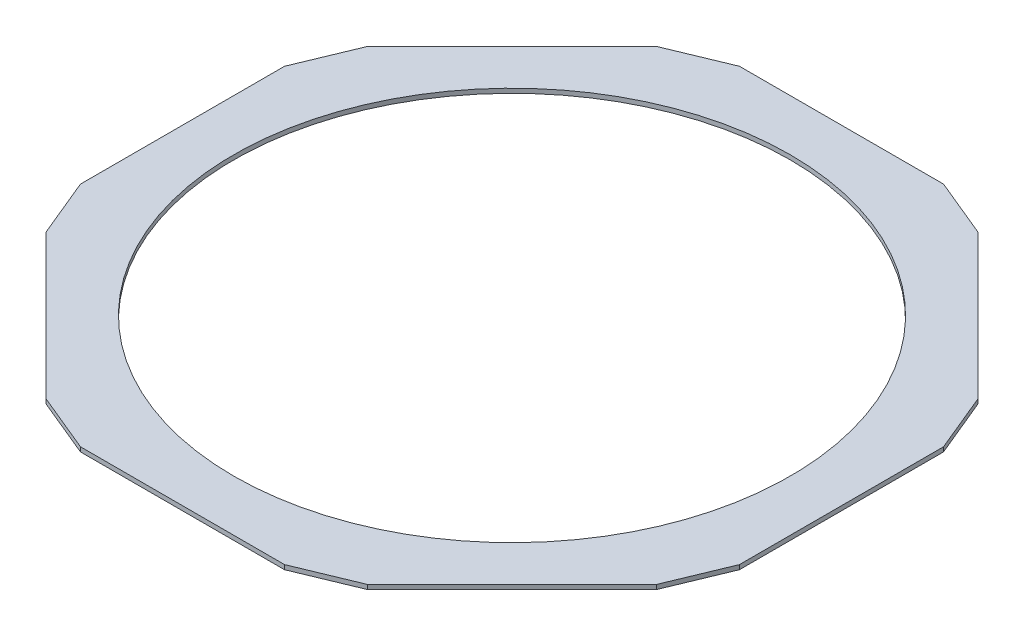
ISO-10303-21;
HEADER;
FILE_DESCRIPTION(('STEP AP214'),'2;1');
FILE_NAME('part.step','',(''),(''),'','','');
FILE_SCHEMA(('AUTOMOTIVE_DESIGN { 1 0 10303 214 1 1 1 1 }'));
ENDSEC;
DATA;
#1=APPLICATION_CONTEXT('core data for automotive mechanical design processes');
#2=APPLICATION_PROTOCOL_DEFINITION('international standard','automotive_design',2000,#1);
#3=PRODUCT_CONTEXT('',#1,'mechanical');
#4=PRODUCT('Part','Part','',(#3));
#5=PRODUCT_RELATED_PRODUCT_CATEGORY('part','',(#4));
#6=PRODUCT_DEFINITION_FORMATION('','',#4);
#7=PRODUCT_DEFINITION_CONTEXT('part definition',#1,'design');
#8=PRODUCT_DEFINITION('design','',#6,#7);
#9=PRODUCT_DEFINITION_SHAPE('','',#8);
#10=(LENGTH_UNIT() NAMED_UNIT(*) SI_UNIT(.MILLI.,.METRE.));
#11=(NAMED_UNIT(*) PLANE_ANGLE_UNIT() SI_UNIT($,.RADIAN.));
#12=(NAMED_UNIT(*) SI_UNIT($,.STERADIAN.) SOLID_ANGLE_UNIT());
#13=UNCERTAINTY_MEASURE_WITH_UNIT(LENGTH_MEASURE(1.E-05),#10,'distance_accuracy_value','');
#14=(GEOMETRIC_REPRESENTATION_CONTEXT(3) GLOBAL_UNCERTAINTY_ASSIGNED_CONTEXT((#13)) GLOBAL_UNIT_ASSIGNED_CONTEXT((#10,
#11,#12)) REPRESENTATION_CONTEXT('',''));
#15=CARTESIAN_POINT('',(0.,0.,0.));
#16=DIRECTION('',(0.,0.,1.));
#17=DIRECTION('',(1.,0.,0.));
#18=AXIS2_PLACEMENT_3D('',#15,#16,#17);
#19=CARTESIAN_POINT('',(0.,0.24,0.));
#20=DIRECTION('',(0.,1.,0.));
#21=DIRECTION('',(0.,0.,1.));
#22=AXIS2_PLACEMENT_3D('',#19,#20,#21);
#23=PLANE('',#22);
#24=DIRECTION('',(0.923879532511292,0.,0.382683432365078));
#25=VECTOR('',#24,1.);
#26=CARTESIAN_POINT('',(-3.16890679651373,0.24,-1.31260417301222));
#27=LINE('',#26,#25);
#28=CARTESIAN_POINT('',(-3.16890679651373,0.24,-1.31260417301222));
#29=VERTEX_POINT('',#28);
#30=CARTESIAN_POINT('',(0.,0.24,0.));
#31=VERTEX_POINT('',#30);
#32=EDGE_CURVE('E236',#29,#31,#27,.T.);
#33=ORIENTED_EDGE('',*,*,#32,.T.);
#34=DIRECTION('',(1.,0.,0.));
#35=VECTOR('',#34,1.);
#36=CARTESIAN_POINT('',(0.,0.24,0.));
#37=LINE('',#36,#35);
#38=CARTESIAN_POINT('',(11.,0.24,0.));
#39=VERTEX_POINT('',#38);
#40=EDGE_CURVE('E124',#31,#39,#37,.T.);
#41=ORIENTED_EDGE('',*,*,#40,.T.);
#42=DIRECTION('',(0.923879532511296,0.,-0.382683432365068));
#43=VECTOR('',#42,1.);
#44=CARTESIAN_POINT('',(11.,0.24,0.));
#45=LINE('',#44,#43);
#46=CARTESIAN_POINT('',(14.1689067965137,0.24,-1.31260417301218));
#47=VERTEX_POINT('',#46);
#48=EDGE_CURVE('E289',#39,#47,#45,.T.);
#49=ORIENTED_EDGE('',*,*,#48,.T.);
#50=DIRECTION('',(0.707106781186546,0.,-0.707106781186549));
#51=VECTOR('',#50,1.);
#52=CARTESIAN_POINT('',(14.1689067965137,0.24,-1.31260417301218));
#53=LINE('',#52,#51);
#54=CARTESIAN_POINT('',(21.9470813895658,0.24,-9.09077876606422));
#55=VERTEX_POINT('',#54);
#56=EDGE_CURVE('E309',#47,#55,#53,.T.);
#57=ORIENTED_EDGE('',*,*,#56,.T.);
#58=DIRECTION('',(0.382683432365071,0.,-0.923879532511295));
#59=VECTOR('',#58,1.);
#60=CARTESIAN_POINT('',(21.9470813895658,0.24,-9.09077876606422));
#61=LINE('',#60,#59);
#62=CARTESIAN_POINT('',(23.2596855625779,0.24,-12.259685562578));
#63=VERTEX_POINT('',#62);
#64=EDGE_CURVE('E305',#55,#63,#61,.T.);
#65=ORIENTED_EDGE('',*,*,#64,.T.);
#66=DIRECTION('',(0.,0.,-1.));
#67=VECTOR('',#66,1.);
#68=CARTESIAN_POINT('',(23.2596855625779,0.24,-12.259685562578));
#69=LINE('',#68,#67);
#70=CARTESIAN_POINT('',(23.2596855625779,0.24,-23.259685562578));
#71=VERTEX_POINT('',#70);
#72=EDGE_CURVE('E308',#63,#71,#69,.T.);
#73=ORIENTED_EDGE('',*,*,#72,.T.);
#74=DIRECTION('',(-0.382683432365094,0.,-0.923879532511285));
#75=VECTOR('',#74,1.);
#76=CARTESIAN_POINT('',(23.2596855625779,0.24,-23.259685562578));
#77=LINE('',#76,#75);
#78=CARTESIAN_POINT('',(21.9470813895657,0.24,-26.4285923590917));
#79=VERTEX_POINT('',#78);
#80=EDGE_CURVE('E313',#71,#79,#77,.T.);
#81=ORIENTED_EDGE('',*,*,#80,.T.);
#82=DIRECTION('',(-0.707106781186549,0.,-0.707106781186546));
#83=VECTOR('',#82,1.);
#84=CARTESIAN_POINT('',(21.9470813895657,0.24,-26.4285923590917));
#85=LINE('',#84,#83);
#86=CARTESIAN_POINT('',(14.1689067965136,0.24,-34.2067669521437));
#87=VERTEX_POINT('',#86);
#88=EDGE_CURVE('E320',#79,#87,#85,.T.);
#89=ORIENTED_EDGE('',*,*,#88,.T.);
#90=DIRECTION('',(-0.923879532511288,0.,-0.382683432365087));
#91=VECTOR('',#90,1.);
#92=CARTESIAN_POINT('',(14.1689067965136,0.24,-34.2067669521437));
#93=LINE('',#92,#91);
#94=CARTESIAN_POINT('',(10.9999999999999,0.24,-35.5193711251559));
#95=VERTEX_POINT('',#94);
#96=EDGE_CURVE('E323',#87,#95,#93,.T.);
#97=ORIENTED_EDGE('',*,*,#96,.T.);
#98=DIRECTION('',(-1.,0.,0.));
#99=VECTOR('',#98,1.);
#100=CARTESIAN_POINT('',(10.9999999999999,0.24,-35.5193711251559));
#101=LINE('',#100,#99);
#102=CARTESIAN_POINT('',(0.,0.24,-35.5193711251559));
#103=VERTEX_POINT('',#102);
#104=EDGE_CURVE('E326',#95,#103,#101,.T.);
#105=ORIENTED_EDGE('',*,*,#104,.T.);
#106=DIRECTION('',(-0.923879532511287,0.,0.382683432365089));
#107=VECTOR('',#106,1.);
#108=CARTESIAN_POINT('',(0.,0.24,-35.5193711251559));
#109=LINE('',#108,#107);
#110=CARTESIAN_POINT('',(-3.16890679651378,0.24,-34.2067669521437));
#111=VERTEX_POINT('',#110);
#112=EDGE_CURVE('E329',#103,#111,#109,.T.);
#113=ORIENTED_EDGE('',*,*,#112,.T.);
#114=DIRECTION('',(-0.707106781186546,0.,0.707106781186549));
#115=VECTOR('',#114,1.);
#116=CARTESIAN_POINT('',(-3.16890679651378,0.24,-34.2067669521437));
#117=LINE('',#116,#115);
#118=CARTESIAN_POINT('',(-10.9470813895658,0.24,-26.4285923590916));
#119=VERTEX_POINT('',#118);
#120=EDGE_CURVE('E332',#111,#119,#117,.T.);
#121=ORIENTED_EDGE('',*,*,#120,.T.);
#122=DIRECTION('',(-0.38268343236509,0.,0.923879532511287));
#123=VECTOR('',#122,1.);
#124=CARTESIAN_POINT('',(-10.9470813895658,0.24,-26.4285923590916));
#125=LINE('',#124,#123);
#126=CARTESIAN_POINT('',(-12.259685562578,0.24,-23.2596855625779));
#127=VERTEX_POINT('',#126);
#128=EDGE_CURVE('E167',#119,#127,#125,.T.);
#129=ORIENTED_EDGE('',*,*,#128,.T.);
#130=DIRECTION('',(0.,0.,1.));
#131=VECTOR('',#130,1.);
#132=CARTESIAN_POINT('',(-12.259685562578,0.24,-23.2596855625779));
#133=LINE('',#132,#131);
#134=CARTESIAN_POINT('',(-12.259685562578,0.24,-12.2596855625779));
#135=VERTEX_POINT('',#134);
#136=EDGE_CURVE('E161',#127,#135,#133,.T.);
#137=ORIENTED_EDGE('',*,*,#136,.T.);
#138=DIRECTION('',(0.382683432365087,0.,0.923879532511288));
#139=VECTOR('',#138,1.);
#140=CARTESIAN_POINT('',(-12.259685562578,0.24,-12.2596855625779));
#141=LINE('',#140,#139);
#142=CARTESIAN_POINT('',(-10.9470813895658,0.24,-9.0907787660642));
#143=VERTEX_POINT('',#142);
#144=EDGE_CURVE('E165',#135,#143,#141,.T.);
#145=ORIENTED_EDGE('',*,*,#144,.T.);
#146=DIRECTION('',(0.707106781186551,0.,0.707106781186544));
#147=VECTOR('',#146,1.);
#148=CARTESIAN_POINT('',(-3.16890679651373,0.24,-1.31260417301222));
#149=LINE('',#148,#147);
#150=EDGE_CURVE('E57',#143,#29,#149,.T.);
#151=ORIENTED_EDGE('',*,*,#150,.T.);
#152=EDGE_LOOP('',(#33,#41,#49,#57,#65,#73,#81,#89,#97,#105,#113,#121,#129,#137,#145,#151));
#153=FACE_BOUND('',#152,.T.);
#154=CARTESIAN_POINT('',(5.49999999999994,0.24,-17.7596855625779));
#155=DIRECTION('',(0.,1.,0.));
#156=DIRECTION('',(0.,0.,1.));
#157=AXIS2_PLACEMENT_3D('',#154,#155,#156);
#158=CIRCLE('',#157,15.);
#159=CARTESIAN_POINT('',(5.49999999999994,0.24,-2.75968556257792));
#160=VERTEX_POINT('',#159);
#161=EDGE_CURVE('E194',#160,#160,#158,.T.);
#162=ORIENTED_EDGE('',*,*,#161,.F.);
#163=EDGE_LOOP('',(#162));
#164=FACE_BOUND('',#163,.T.);
#165=ADVANCED_FACE('F39',(#153,#164),#23,.T.);
#166=CARTESIAN_POINT('',(0.,0.,0.));
#167=DIRECTION('',(0.,1.,0.));
#168=DIRECTION('',(0.,0.,1.));
#169=AXIS2_PLACEMENT_3D('',#166,#167,#168);
#170=PLANE('',#169);
#171=DIRECTION('',(0.923879532511292,0.,0.382683432365078));
#172=VECTOR('',#171,1.);
#173=CARTESIAN_POINT('',(-3.16890679651373,0.,-1.31260417301222));
#174=LINE('',#173,#172);
#175=CARTESIAN_POINT('',(-3.16890679651373,0.,-1.31260417301222));
#176=VERTEX_POINT('',#175);
#177=CARTESIAN_POINT('',(0.,0.,0.));
#178=VERTEX_POINT('',#177);
#179=EDGE_CURVE('E189',#176,#178,#174,.T.);
#180=ORIENTED_EDGE('',*,*,#179,.F.);
#181=DIRECTION('',(0.707106781186551,0.,0.707106781186544));
#182=VECTOR('',#181,1.);
#183=CARTESIAN_POINT('',(-3.16890679651373,0.,-1.31260417301222));
#184=LINE('',#183,#182);
#185=CARTESIAN_POINT('',(-10.9470813895658,0.,-9.0907787660642));
#186=VERTEX_POINT('',#185);
#187=EDGE_CURVE('E116',#186,#176,#184,.T.);
#188=ORIENTED_EDGE('',*,*,#187,.F.);
#189=DIRECTION('',(0.382683432365087,0.,0.923879532511288));
#190=VECTOR('',#189,1.);
#191=CARTESIAN_POINT('',(-12.259685562578,0.,-12.2596855625779));
#192=LINE('',#191,#190);
#193=CARTESIAN_POINT('',(-12.259685562578,0.,-12.2596855625779));
#194=VERTEX_POINT('',#193);
#195=EDGE_CURVE('E110',#194,#186,#192,.T.);
#196=ORIENTED_EDGE('',*,*,#195,.F.);
#197=DIRECTION('',(0.,0.,1.));
#198=VECTOR('',#197,1.);
#199=CARTESIAN_POINT('',(-12.259685562578,0.,-23.2596855625779));
#200=LINE('',#199,#198);
#201=CARTESIAN_POINT('',(-12.259685562578,0.,-23.2596855625779));
#202=VERTEX_POINT('',#201);
#203=EDGE_CURVE('E176',#202,#194,#200,.T.);
#204=ORIENTED_EDGE('',*,*,#203,.F.);
#205=DIRECTION('',(-0.38268343236509,0.,0.923879532511287));
#206=VECTOR('',#205,1.);
#207=CARTESIAN_POINT('',(-10.9470813895658,0.,-26.4285923590916));
#208=LINE('',#207,#206);
#209=CARTESIAN_POINT('',(-10.9470813895658,0.,-26.4285923590916));
#210=VERTEX_POINT('',#209);
#211=EDGE_CURVE('E227',#210,#202,#208,.T.);
#212=ORIENTED_EDGE('',*,*,#211,.F.);
#213=DIRECTION('',(-0.707106781186546,0.,0.707106781186549));
#214=VECTOR('',#213,1.);
#215=CARTESIAN_POINT('',(-3.16890679651378,0.,-34.2067669521437));
#216=LINE('',#215,#214);
#217=CARTESIAN_POINT('',(-3.16890679651378,0.,-34.2067669521437));
#218=VERTEX_POINT('',#217);
#219=EDGE_CURVE('E224',#218,#210,#216,.T.);
#220=ORIENTED_EDGE('',*,*,#219,.F.);
#221=DIRECTION('',(-0.923879532511287,0.,0.382683432365089));
#222=VECTOR('',#221,1.);
#223=CARTESIAN_POINT('',(0.,0.,-35.5193711251559));
#224=LINE('',#223,#222);
#225=CARTESIAN_POINT('',(0.,0.,-35.5193711251559));
#226=VERTEX_POINT('',#225);
#227=EDGE_CURVE('E221',#226,#218,#224,.T.);
#228=ORIENTED_EDGE('',*,*,#227,.F.);
#229=DIRECTION('',(-1.,0.,0.));
#230=VECTOR('',#229,1.);
#231=CARTESIAN_POINT('',(10.9999999999999,0.,-35.5193711251559));
#232=LINE('',#231,#230);
#233=CARTESIAN_POINT('',(10.9999999999999,0.,-35.5193711251559));
#234=VERTEX_POINT('',#233);
#235=EDGE_CURVE('E218',#234,#226,#232,.T.);
#236=ORIENTED_EDGE('',*,*,#235,.F.);
#237=DIRECTION('',(-0.923879532511288,0.,-0.382683432365087));
#238=VECTOR('',#237,1.);
#239=CARTESIAN_POINT('',(14.1689067965136,0.,-34.2067669521437));
#240=LINE('',#239,#238);
#241=CARTESIAN_POINT('',(14.1689067965136,0.,-34.2067669521437));
#242=VERTEX_POINT('',#241);
#243=EDGE_CURVE('E215',#242,#234,#240,.T.);
#244=ORIENTED_EDGE('',*,*,#243,.F.);
#245=DIRECTION('',(-0.707106781186549,0.,-0.707106781186546));
#246=VECTOR('',#245,1.);
#247=CARTESIAN_POINT('',(21.9470813895657,0.,-26.4285923590917));
#248=LINE('',#247,#246);
#249=CARTESIAN_POINT('',(21.9470813895657,0.,-26.4285923590917));
#250=VERTEX_POINT('',#249);
#251=EDGE_CURVE('E212',#250,#242,#248,.T.);
#252=ORIENTED_EDGE('',*,*,#251,.F.);
#253=DIRECTION('',(-0.382683432365094,0.,-0.923879532511285));
#254=VECTOR('',#253,1.);
#255=CARTESIAN_POINT('',(23.2596855625779,0.,-23.259685562578));
#256=LINE('',#255,#254);
#257=CARTESIAN_POINT('',(23.2596855625779,0.,-23.259685562578));
#258=VERTEX_POINT('',#257);
#259=EDGE_CURVE('E209',#258,#250,#256,.T.);
#260=ORIENTED_EDGE('',*,*,#259,.F.);
#261=DIRECTION('',(0.,0.,-1.));
#262=VECTOR('',#261,1.);
#263=CARTESIAN_POINT('',(23.2596855625779,0.,-12.259685562578));
#264=LINE('',#263,#262);
#265=CARTESIAN_POINT('',(23.2596855625779,0.,-12.259685562578));
#266=VERTEX_POINT('',#265);
#267=EDGE_CURVE('E206',#266,#258,#264,.T.);
#268=ORIENTED_EDGE('',*,*,#267,.F.);
#269=DIRECTION('',(0.382683432365071,0.,-0.923879532511295));
#270=VECTOR('',#269,1.);
#271=CARTESIAN_POINT('',(21.9470813895658,0.,-9.09077876606422));
#272=LINE('',#271,#270);
#273=CARTESIAN_POINT('',(21.9470813895658,0.,-9.09077876606422));
#274=VERTEX_POINT('',#273);
#275=EDGE_CURVE('E203',#274,#266,#272,.T.);
#276=ORIENTED_EDGE('',*,*,#275,.F.);
#277=DIRECTION('',(0.707106781186546,0.,-0.707106781186549));
#278=VECTOR('',#277,1.);
#279=CARTESIAN_POINT('',(14.1689067965137,0.,-1.31260417301218));
#280=LINE('',#279,#278);
#281=CARTESIAN_POINT('',(14.1689067965137,0.,-1.31260417301218));
#282=VERTEX_POINT('',#281);
#283=EDGE_CURVE('E200',#282,#274,#280,.T.);
#284=ORIENTED_EDGE('',*,*,#283,.F.);
#285=DIRECTION('',(0.923879532511296,0.,-0.382683432365068));
#286=VECTOR('',#285,1.);
#287=CARTESIAN_POINT('',(11.,0.,0.));
#288=LINE('',#287,#286);
#289=CARTESIAN_POINT('',(11.,0.,0.));
#290=VERTEX_POINT('',#289);
#291=EDGE_CURVE('E197',#290,#282,#288,.T.);
#292=ORIENTED_EDGE('',*,*,#291,.F.);
#293=DIRECTION('',(1.,0.,0.));
#294=VECTOR('',#293,1.);
#295=CARTESIAN_POINT('',(0.,0.,0.));
#296=LINE('',#295,#294);
#297=EDGE_CURVE('E193',#178,#290,#296,.T.);
#298=ORIENTED_EDGE('',*,*,#297,.F.);
#299=EDGE_LOOP('',(#180,#188,#196,#204,#212,#220,#228,#236,#244,#252,#260,#268,#276,#284,#292,#298));
#300=FACE_BOUND('',#299,.T.);
#301=CARTESIAN_POINT('',(5.49999999999994,0.,-17.7596855625779));
#302=DIRECTION('',(0.,1.,0.));
#303=DIRECTION('',(0.,0.,1.));
#304=AXIS2_PLACEMENT_3D('',#301,#302,#303);
#305=CIRCLE('',#304,15.);
#306=CARTESIAN_POINT('',(5.49999999999994,0.,-2.75968556257792));
#307=VERTEX_POINT('',#306);
#308=EDGE_CURVE('E533',#307,#307,#305,.T.);
#309=ORIENTED_EDGE('',*,*,#308,.T.);
#310=EDGE_LOOP('',(#309));
#311=FACE_BOUND('',#310,.T.);
#312=ADVANCED_FACE('F293',(#300,#311),#170,.F.);
#313=CARTESIAN_POINT('',(-3.16890679651373,0.24,-1.31260417301222));
#314=DIRECTION('',(0.382683432365078,0.,-0.923879532511292));
#315=DIRECTION('',(-0.923879532511292,0.,-0.382683432365078));
#316=AXIS2_PLACEMENT_3D('',#313,#314,#315);
#317=PLANE('',#316);
#318=ORIENTED_EDGE('',*,*,#179,.T.);
#319=DIRECTION('',(0.,-1.,0.));
#320=VECTOR('',#319,1.);
#321=CARTESIAN_POINT('',(0.,0.24,0.));
#322=LINE('',#321,#320);
#323=EDGE_CURVE('E11',#31,#178,#322,.T.);
#324=ORIENTED_EDGE('',*,*,#323,.F.);
#325=ORIENTED_EDGE('',*,*,#32,.F.);
#326=DIRECTION('',(0.,-1.,0.));
#327=VECTOR('',#326,1.);
#328=CARTESIAN_POINT('',(-3.16890679651373,0.24,-1.31260417301222));
#329=LINE('',#328,#327);
#330=EDGE_CURVE('E185',#29,#176,#329,.T.);
#331=ORIENTED_EDGE('',*,*,#330,.T.);
#332=EDGE_LOOP('',(#318,#324,#325,#331));
#333=FACE_BOUND('',#332,.T.);
#334=ADVANCED_FACE('F41',(#333),#317,.F.);
#335=CARTESIAN_POINT('',(0.,0.24,0.));
#336=DIRECTION('',(0.,0.,-1.));
#337=DIRECTION('',(-1.,0.,0.));
#338=AXIS2_PLACEMENT_3D('',#335,#336,#337);
#339=PLANE('',#338);
#340=ORIENTED_EDGE('',*,*,#297,.T.);
#341=DIRECTION('',(0.,-1.,0.));
#342=VECTOR('',#341,1.);
#343=CARTESIAN_POINT('',(11.,0.24,0.));
#344=LINE('',#343,#342);
#345=EDGE_CURVE('E49',#39,#290,#344,.T.);
#346=ORIENTED_EDGE('',*,*,#345,.F.);
#347=ORIENTED_EDGE('',*,*,#40,.F.);
#348=ORIENTED_EDGE('',*,*,#323,.T.);
#349=EDGE_LOOP('',(#340,#346,#347,#348));
#350=FACE_BOUND('',#349,.T.);
#351=ADVANCED_FACE('F368',(#350),#339,.F.);
#352=CARTESIAN_POINT('',(11.,0.24,0.));
#353=DIRECTION('',(-0.382683432365069,0.,-0.923879532511296));
#354=DIRECTION('',(-0.923879532511296,0.,0.382683432365068));
#355=AXIS2_PLACEMENT_3D('',#352,#353,#354);
#356=PLANE('',#355);
#357=ORIENTED_EDGE('',*,*,#291,.T.);
#358=DIRECTION('',(0.,-1.,0.));
#359=VECTOR('',#358,1.);
#360=CARTESIAN_POINT('',(14.1689067965137,0.24,-1.31260417301218));
#361=LINE('',#360,#359);
#362=EDGE_CURVE('E279',#47,#282,#361,.T.);
#363=ORIENTED_EDGE('',*,*,#362,.F.);
#364=ORIENTED_EDGE('',*,*,#48,.F.);
#365=ORIENTED_EDGE('',*,*,#345,.T.);
#366=EDGE_LOOP('',(#357,#363,#364,#365));
#367=FACE_BOUND('',#366,.T.);
#368=ADVANCED_FACE('F287',(#367),#356,.F.);
#369=CARTESIAN_POINT('',(14.1689067965137,0.24,-1.31260417301218));
#370=DIRECTION('',(-0.707106781186549,0.,-0.707106781186546));
#371=DIRECTION('',(-0.707106781186546,0.,0.707106781186549));
#372=AXIS2_PLACEMENT_3D('',#369,#370,#371);
#373=PLANE('',#372);
#374=ORIENTED_EDGE('',*,*,#283,.T.);
#375=DIRECTION('',(0.,-1.,0.));
#376=VECTOR('',#375,1.);
#377=CARTESIAN_POINT('',(21.9470813895658,0.24,-9.09077876606422));
#378=LINE('',#377,#376);
#379=EDGE_CURVE('E275',#55,#274,#378,.T.);
#380=ORIENTED_EDGE('',*,*,#379,.F.);
#381=ORIENTED_EDGE('',*,*,#56,.F.);
#382=ORIENTED_EDGE('',*,*,#362,.T.);
#383=EDGE_LOOP('',(#374,#380,#381,#382));
#384=FACE_BOUND('',#383,.T.);
#385=ADVANCED_FACE('F299',(#384),#373,.F.);
#386=CARTESIAN_POINT('',(21.9470813895658,0.24,-9.09077876606422));
#387=DIRECTION('',(-0.923879532511295,0.,-0.382683432365071));
#388=DIRECTION('',(-0.382683432365071,0.,0.923879532511295));
#389=AXIS2_PLACEMENT_3D('',#386,#387,#388);
#390=PLANE('',#389);
#391=ORIENTED_EDGE('',*,*,#275,.T.);
#392=DIRECTION('',(0.,-1.,0.));
#393=VECTOR('',#392,1.);
#394=CARTESIAN_POINT('',(23.2596855625779,0.24,-12.259685562578));
#395=LINE('',#394,#393);
#396=EDGE_CURVE('E271',#63,#266,#395,.T.);
#397=ORIENTED_EDGE('',*,*,#396,.F.);
#398=ORIENTED_EDGE('',*,*,#64,.F.);
#399=ORIENTED_EDGE('',*,*,#379,.T.);
#400=EDGE_LOOP('',(#391,#397,#398,#399));
#401=FACE_BOUND('',#400,.T.);
#402=ADVANCED_FACE('F303',(#401),#390,.F.);
#403=CARTESIAN_POINT('',(23.2596855625779,0.24,-12.259685562578));
#404=DIRECTION('',(-1.,0.,0.));
#405=DIRECTION('',(0.,0.,1.));
#406=AXIS2_PLACEMENT_3D('',#403,#404,#405);
#407=PLANE('',#406);
#408=ORIENTED_EDGE('',*,*,#267,.T.);
#409=DIRECTION('',(0.,-1.,0.));
#410=VECTOR('',#409,1.);
#411=CARTESIAN_POINT('',(23.2596855625779,0.24,-23.259685562578));
#412=LINE('',#411,#410);
#413=EDGE_CURVE('E267',#71,#258,#412,.T.);
#414=ORIENTED_EDGE('',*,*,#413,.F.);
#415=ORIENTED_EDGE('',*,*,#72,.F.);
#416=ORIENTED_EDGE('',*,*,#396,.T.);
#417=EDGE_LOOP('',(#408,#414,#415,#416));
#418=FACE_BOUND('',#417,.T.);
#419=ADVANCED_FACE('F381',(#418),#407,.F.);
#420=CARTESIAN_POINT('',(23.2596855625779,0.24,-23.259685562578));
#421=DIRECTION('',(-0.923879532511285,0.,0.382683432365094));
#422=DIRECTION('',(0.382683432365094,0.,0.923879532511285));
#423=AXIS2_PLACEMENT_3D('',#420,#421,#422);
#424=PLANE('',#423);
#425=ORIENTED_EDGE('',*,*,#259,.T.);
#426=DIRECTION('',(0.,-1.,0.));
#427=VECTOR('',#426,1.);
#428=CARTESIAN_POINT('',(21.9470813895657,0.24,-26.4285923590917));
#429=LINE('',#428,#427);
#430=EDGE_CURVE('E263',#79,#250,#429,.T.);
#431=ORIENTED_EDGE('',*,*,#430,.F.);
#432=ORIENTED_EDGE('',*,*,#80,.F.);
#433=ORIENTED_EDGE('',*,*,#413,.T.);
#434=EDGE_LOOP('',(#425,#431,#432,#433));
#435=FACE_BOUND('',#434,.T.);
#436=ADVANCED_FACE('F384',(#435),#424,.F.);
#437=CARTESIAN_POINT('',(21.9470813895657,0.24,-26.4285923590917));
#438=DIRECTION('',(-0.707106781186546,0.,0.707106781186549));
#439=DIRECTION('',(0.707106781186549,0.,0.707106781186546));
#440=AXIS2_PLACEMENT_3D('',#437,#438,#439);
#441=PLANE('',#440);
#442=ORIENTED_EDGE('',*,*,#251,.T.);
#443=DIRECTION('',(0.,-1.,0.));
#444=VECTOR('',#443,1.);
#445=CARTESIAN_POINT('',(14.1689067965136,0.24,-34.2067669521437));
#446=LINE('',#445,#444);
#447=EDGE_CURVE('E259',#87,#242,#446,.T.);
#448=ORIENTED_EDGE('',*,*,#447,.F.);
#449=ORIENTED_EDGE('',*,*,#88,.F.);
#450=ORIENTED_EDGE('',*,*,#430,.T.);
#451=EDGE_LOOP('',(#442,#448,#449,#450));
#452=FACE_BOUND('',#451,.T.);
#453=ADVANCED_FACE('F388',(#452),#441,.F.);
#454=CARTESIAN_POINT('',(14.1689067965136,0.24,-34.2067669521437));
#455=DIRECTION('',(-0.382683432365087,0.,0.923879532511288));
#456=DIRECTION('',(0.923879532511288,0.,0.382683432365087));
#457=AXIS2_PLACEMENT_3D('',#454,#455,#456);
#458=PLANE('',#457);
#459=ORIENTED_EDGE('',*,*,#243,.T.);
#460=DIRECTION('',(0.,-1.,0.));
#461=VECTOR('',#460,1.);
#462=CARTESIAN_POINT('',(10.9999999999999,0.24,-35.5193711251559));
#463=LINE('',#462,#461);
#464=EDGE_CURVE('E255',#95,#234,#463,.T.);
#465=ORIENTED_EDGE('',*,*,#464,.F.);
#466=ORIENTED_EDGE('',*,*,#96,.F.);
#467=ORIENTED_EDGE('',*,*,#447,.T.);
#468=EDGE_LOOP('',(#459,#465,#466,#467));
#469=FACE_BOUND('',#468,.T.);
#470=ADVANCED_FACE('F392',(#469),#458,.F.);
#471=CARTESIAN_POINT('',(10.9999999999999,0.24,-35.5193711251559));
#472=DIRECTION('',(0.,0.,1.));
#473=DIRECTION('',(1.,0.,0.));
#474=AXIS2_PLACEMENT_3D('',#471,#472,#473);
#475=PLANE('',#474);
#476=ORIENTED_EDGE('',*,*,#235,.T.);
#477=DIRECTION('',(0.,-1.,0.));
#478=VECTOR('',#477,1.);
#479=CARTESIAN_POINT('',(0.,0.24,-35.5193711251559));
#480=LINE('',#479,#478);
#481=EDGE_CURVE('E251',#103,#226,#480,.T.);
#482=ORIENTED_EDGE('',*,*,#481,.F.);
#483=ORIENTED_EDGE('',*,*,#104,.F.);
#484=ORIENTED_EDGE('',*,*,#464,.T.);
#485=EDGE_LOOP('',(#476,#482,#483,#484));
#486=FACE_BOUND('',#485,.T.);
#487=ADVANCED_FACE('F396',(#486),#475,.F.);
#488=CARTESIAN_POINT('',(0.,0.24,-35.5193711251559));
#489=DIRECTION('',(0.382683432365089,0.,0.923879532511287));
#490=DIRECTION('',(0.923879532511287,0.,-0.382683432365089));
#491=AXIS2_PLACEMENT_3D('',#488,#489,#490);
#492=PLANE('',#491);
#493=ORIENTED_EDGE('',*,*,#227,.T.);
#494=DIRECTION('',(0.,-1.,0.));
#495=VECTOR('',#494,1.);
#496=CARTESIAN_POINT('',(-3.16890679651378,0.24,-34.2067669521437));
#497=LINE('',#496,#495);
#498=EDGE_CURVE('E247',#111,#218,#497,.T.);
#499=ORIENTED_EDGE('',*,*,#498,.F.);
#500=ORIENTED_EDGE('',*,*,#112,.F.);
#501=ORIENTED_EDGE('',*,*,#481,.T.);
#502=EDGE_LOOP('',(#493,#499,#500,#501));
#503=FACE_BOUND('',#502,.T.);
#504=ADVANCED_FACE('F400',(#503),#492,.F.);
#505=CARTESIAN_POINT('',(-3.16890679651378,0.24,-34.2067669521437));
#506=DIRECTION('',(0.707106781186549,0.,0.707106781186546));
#507=DIRECTION('',(0.707106781186546,0.,-0.707106781186549));
#508=AXIS2_PLACEMENT_3D('',#505,#506,#507);
#509=PLANE('',#508);
#510=ORIENTED_EDGE('',*,*,#219,.T.);
#511=DIRECTION('',(0.,-1.,0.));
#512=VECTOR('',#511,1.);
#513=CARTESIAN_POINT('',(-10.9470813895658,0.24,-26.4285923590916));
#514=LINE('',#513,#512);
#515=EDGE_CURVE('E243',#119,#210,#514,.T.);
#516=ORIENTED_EDGE('',*,*,#515,.F.);
#517=ORIENTED_EDGE('',*,*,#120,.F.);
#518=ORIENTED_EDGE('',*,*,#498,.T.);
#519=EDGE_LOOP('',(#510,#516,#517,#518));
#520=FACE_BOUND('',#519,.T.);
#521=ADVANCED_FACE('F340',(#520),#509,.F.);
#522=CARTESIAN_POINT('',(-10.9470813895658,0.24,-26.4285923590916));
#523=DIRECTION('',(0.923879532511287,0.,0.38268343236509));
#524=DIRECTION('',(0.38268343236509,0.,-0.923879532511287));
#525=AXIS2_PLACEMENT_3D('',#522,#523,#524);
#526=PLANE('',#525);
#527=ORIENTED_EDGE('',*,*,#211,.T.);
#528=DIRECTION('',(0.,-1.,0.));
#529=VECTOR('',#528,1.);
#530=CARTESIAN_POINT('',(-12.259685562578,0.24,-23.2596855625779));
#531=LINE('',#530,#529);
#532=EDGE_CURVE('E178',#127,#202,#531,.T.);
#533=ORIENTED_EDGE('',*,*,#532,.F.);
#534=ORIENTED_EDGE('',*,*,#128,.F.);
#535=ORIENTED_EDGE('',*,*,#515,.T.);
#536=EDGE_LOOP('',(#527,#533,#534,#535));
#537=FACE_BOUND('',#536,.T.);
#538=ADVANCED_FACE('F344',(#537),#526,.F.);
#539=CARTESIAN_POINT('',(-12.259685562578,0.24,-23.2596855625779));
#540=DIRECTION('',(1.,0.,0.));
#541=DIRECTION('',(0.,0.,-1.));
#542=AXIS2_PLACEMENT_3D('',#539,#540,#541);
#543=PLANE('',#542);
#544=ORIENTED_EDGE('',*,*,#203,.T.);
#545=DIRECTION('',(0.,-1.,0.));
#546=VECTOR('',#545,1.);
#547=CARTESIAN_POINT('',(-12.259685562578,0.24,-12.2596855625779));
#548=LINE('',#547,#546);
#549=EDGE_CURVE('E173',#135,#194,#548,.T.);
#550=ORIENTED_EDGE('',*,*,#549,.F.);
#551=ORIENTED_EDGE('',*,*,#136,.F.);
#552=ORIENTED_EDGE('',*,*,#532,.T.);
#553=EDGE_LOOP('',(#544,#550,#551,#552));
#554=FACE_BOUND('',#553,.T.);
#555=ADVANCED_FACE('F174',(#554),#543,.F.);
#556=CARTESIAN_POINT('',(-12.259685562578,0.24,-12.2596855625779));
#557=DIRECTION('',(0.923879532511288,0.,-0.382683432365087));
#558=DIRECTION('',(-0.382683432365087,0.,-0.923879532511288));
#559=AXIS2_PLACEMENT_3D('',#556,#557,#558);
#560=PLANE('',#559);
#561=ORIENTED_EDGE('',*,*,#195,.T.);
#562=DIRECTION('',(0.,-1.,0.));
#563=VECTOR('',#562,1.);
#564=CARTESIAN_POINT('',(-10.9470813895658,0.24,-9.0907787660642));
#565=LINE('',#564,#563);
#566=EDGE_CURVE('E179',#143,#186,#565,.T.);
#567=ORIENTED_EDGE('',*,*,#566,.F.);
#568=ORIENTED_EDGE('',*,*,#144,.F.);
#569=ORIENTED_EDGE('',*,*,#549,.T.);
#570=EDGE_LOOP('',(#561,#567,#568,#569));
#571=FACE_BOUND('',#570,.T.);
#572=ADVANCED_FACE('F181',(#571),#560,.F.);
#573=CARTESIAN_POINT('',(-3.16890679651373,0.24,-1.31260417301222));
#574=DIRECTION('',(0.707106781186544,0.,-0.707106781186551));
#575=DIRECTION('',(-0.707106781186551,0.,-0.707106781186544));
#576=AXIS2_PLACEMENT_3D('',#573,#574,#575);
#577=PLANE('',#576);
#578=ORIENTED_EDGE('',*,*,#187,.T.);
#579=ORIENTED_EDGE('',*,*,#330,.F.);
#580=ORIENTED_EDGE('',*,*,#150,.F.);
#581=ORIENTED_EDGE('',*,*,#566,.T.);
#582=EDGE_LOOP('',(#578,#579,#580,#581));
#583=FACE_BOUND('',#582,.T.);
#584=ADVANCED_FACE('F348',(#583),#577,.F.);
#585=CARTESIAN_POINT('',(5.49999999999994,0.24,-17.7596855625779));
#586=DIRECTION('',(0.,-1.,0.));
#587=DIRECTION('',(0.,0.,-1.));
#588=AXIS2_PLACEMENT_3D('',#585,#586,#587);
#589=CYLINDRICAL_SURFACE('',#588,15.);
#590=ORIENTED_EDGE('',*,*,#161,.T.);
#591=EDGE_LOOP('',(#590));
#592=FACE_BOUND('',#591,.T.);
#593=ORIENTED_EDGE('',*,*,#308,.F.);
#594=EDGE_LOOP('',(#593));
#595=FACE_BOUND('',#594,.T.);
#596=ADVANCED_FACE('F350',(#592,#595),#589,.F.);
#597=CLOSED_SHELL('',(#165,#312,#334,#351,#368,#385,#402,#419,#436,#453,#470,#487,#504,#521,
#538,#555,#572,#584,#596));
#598=MANIFOLD_SOLID_BREP('B2',#597);
#599=ADVANCED_BREP_SHAPE_REPRESENTATION('',(#18,#598),#14);
#600=SHAPE_DEFINITION_REPRESENTATION(#9,#599);
ENDSEC;
END-ISO-10303-21;
